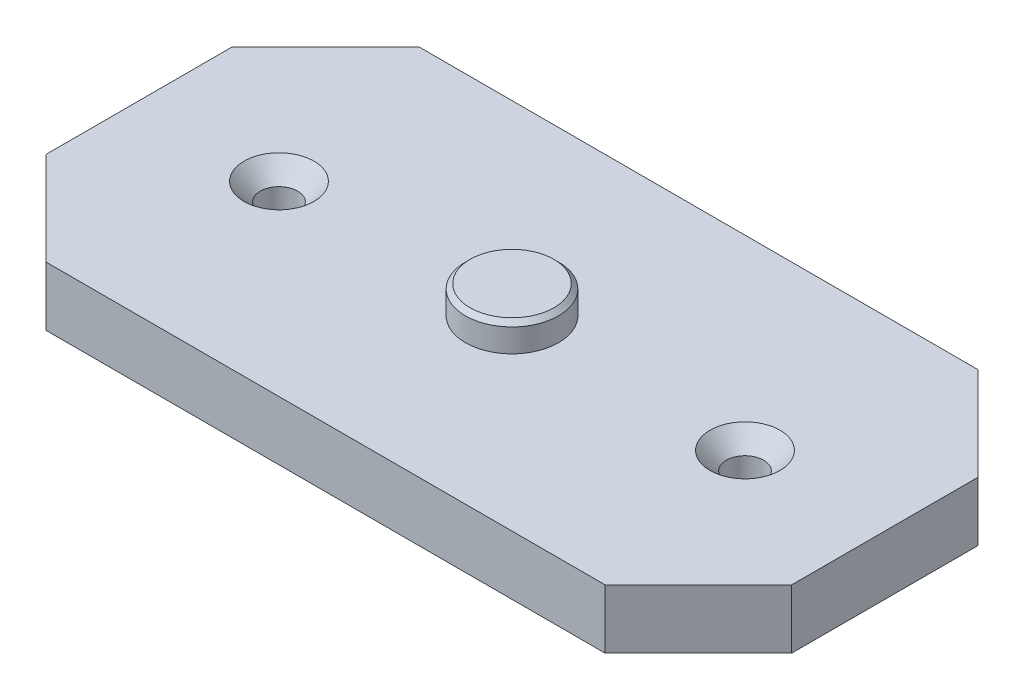
ISO-10303-21;
HEADER;
FILE_DESCRIPTION(('STEP AP214'),'2;1');
FILE_NAME('part.step','',(''),(''),'','','');
FILE_SCHEMA(('AUTOMOTIVE_DESIGN { 1 0 10303 214 1 1 1 1 }'));
ENDSEC;
DATA;
#1=APPLICATION_CONTEXT('core data for automotive mechanical design processes');
#2=APPLICATION_PROTOCOL_DEFINITION('international standard','automotive_design',2000,#1);
#3=PRODUCT_CONTEXT('',#1,'mechanical');
#4=PRODUCT('Part','Part','',(#3));
#5=PRODUCT_RELATED_PRODUCT_CATEGORY('part','',(#4));
#6=PRODUCT_DEFINITION_FORMATION('','',#4);
#7=PRODUCT_DEFINITION_CONTEXT('part definition',#1,'design');
#8=PRODUCT_DEFINITION('design','',#6,#7);
#9=PRODUCT_DEFINITION_SHAPE('','',#8);
#10=(LENGTH_UNIT() NAMED_UNIT(*) SI_UNIT(.MILLI.,.METRE.));
#11=(NAMED_UNIT(*) PLANE_ANGLE_UNIT() SI_UNIT($,.RADIAN.));
#12=(NAMED_UNIT(*) SI_UNIT($,.STERADIAN.) SOLID_ANGLE_UNIT());
#13=UNCERTAINTY_MEASURE_WITH_UNIT(LENGTH_MEASURE(1.E-05),#10,'distance_accuracy_value','');
#14=(GEOMETRIC_REPRESENTATION_CONTEXT(3) GLOBAL_UNCERTAINTY_ASSIGNED_CONTEXT((#13)) GLOBAL_UNIT_ASSIGNED_CONTEXT((#10,
#11,#12)) REPRESENTATION_CONTEXT('',''));
#15=CARTESIAN_POINT('',(0.,0.,0.));
#16=DIRECTION('',(0.,0.,1.));
#17=DIRECTION('',(1.,0.,0.));
#18=AXIS2_PLACEMENT_3D('',#15,#16,#17);
#19=CARTESIAN_POINT('',(0.,6.35,0.));
#20=DIRECTION('',(0.,-1.,0.));
#21=DIRECTION('',(0.,0.,-1.));
#22=AXIS2_PLACEMENT_3D('',#19,#20,#21);
#23=PLANE('',#22);
#24=CARTESIAN_POINT('',(0.,6.35,0.));
#25=DIRECTION('',(0.,-1.,0.));
#26=DIRECTION('',(0.,0.,-1.));
#27=AXIS2_PLACEMENT_3D('',#24,#25,#26);
#28=CIRCLE('',#27,5.);
#29=CARTESIAN_POINT('',(0.,6.35,-5.));
#30=VERTEX_POINT('',#29);
#31=EDGE_CURVE('E283',#30,#30,#28,.T.);
#32=ORIENTED_EDGE('',*,*,#31,.T.);
#33=EDGE_LOOP('',(#32));
#34=FACE_BOUND('',#33,.T.);
#35=DIRECTION('',(0.,0.,1.));
#36=VECTOR('',#35,1.);
#37=CARTESIAN_POINT('',(-40.,6.35,20.));
#38=LINE('',#37,#36);
#39=CARTESIAN_POINT('',(-40.,6.35,-10.));
#40=VERTEX_POINT('',#39);
#41=CARTESIAN_POINT('',(-40.,6.35,9.99999999999996));
#42=VERTEX_POINT('',#41);
#43=EDGE_CURVE('E263',#40,#42,#38,.T.);
#44=ORIENTED_EDGE('',*,*,#43,.T.);
#45=DIRECTION('',(-0.707106781186547,0.,-0.707106781186549));
#46=VECTOR('',#45,1.);
#47=CARTESIAN_POINT('',(-30.,6.35,20.));
#48=LINE('',#47,#46);
#49=CARTESIAN_POINT('',(-30.,6.35,20.));
#50=VERTEX_POINT('',#49);
#51=EDGE_CURVE('E160',#42,#50,#48,.F.);
#52=ORIENTED_EDGE('',*,*,#51,.T.);
#53=DIRECTION('',(1.,0.,0.));
#54=VECTOR('',#53,1.);
#55=CARTESIAN_POINT('',(-40.,6.35,20.));
#56=LINE('',#55,#54);
#57=CARTESIAN_POINT('',(30.,6.35,20.));
#58=VERTEX_POINT('',#57);
#59=EDGE_CURVE('E129',#50,#58,#56,.T.);
#60=ORIENTED_EDGE('',*,*,#59,.T.);
#61=DIRECTION('',(-0.707106781186549,0.,0.707106781186547));
#62=VECTOR('',#61,1.);
#63=CARTESIAN_POINT('',(40.,6.35,10.));
#64=LINE('',#63,#62);
#65=CARTESIAN_POINT('',(40.,6.35,10.));
#66=VERTEX_POINT('',#65);
#67=EDGE_CURVE('E155',#58,#66,#64,.F.);
#68=ORIENTED_EDGE('',*,*,#67,.T.);
#69=DIRECTION('',(0.,0.,-1.));
#70=VECTOR('',#69,1.);
#71=CARTESIAN_POINT('',(40.,6.35,20.));
#72=LINE('',#71,#70);
#73=CARTESIAN_POINT('',(40.,6.35,-9.99999999999998));
#74=VERTEX_POINT('',#73);
#75=EDGE_CURVE('E135',#66,#74,#72,.T.);
#76=ORIENTED_EDGE('',*,*,#75,.T.);
#77=DIRECTION('',(0.707106781186547,0.,0.707106781186549));
#78=VECTOR('',#77,1.);
#79=CARTESIAN_POINT('',(30.,6.35,-20.));
#80=LINE('',#79,#78);
#81=CARTESIAN_POINT('',(30.,6.35,-20.));
#82=VERTEX_POINT('',#81);
#83=EDGE_CURVE('E64',#74,#82,#80,.F.);
#84=ORIENTED_EDGE('',*,*,#83,.T.);
#85=DIRECTION('',(-1.,0.,0.));
#86=VECTOR('',#85,1.);
#87=CARTESIAN_POINT('',(-40.,6.35,-20.));
#88=LINE('',#87,#86);
#89=CARTESIAN_POINT('',(-30.,6.35,-20.));
#90=VERTEX_POINT('',#89);
#91=EDGE_CURVE('E138',#82,#90,#88,.T.);
#92=ORIENTED_EDGE('',*,*,#91,.T.);
#93=DIRECTION('',(0.707106781186549,0.,-0.707106781186547));
#94=VECTOR('',#93,1.);
#95=CARTESIAN_POINT('',(-40.,6.35,-10.));
#96=LINE('',#95,#94);
#97=EDGE_CURVE('E158',#90,#40,#96,.F.);
#98=ORIENTED_EDGE('',*,*,#97,.T.);
#99=EDGE_LOOP('',(#44,#52,#60,#68,#76,#84,#92,#98));
#100=FACE_BOUND('',#99,.T.);
#101=CARTESIAN_POINT('',(25.,6.35,0.));
#102=DIRECTION('',(0.,1.,0.));
#103=DIRECTION('',(0.,0.,1.));
#104=AXIS2_PLACEMENT_3D('',#101,#102,#103);
#105=CIRCLE('',#104,3.75);
#106=CARTESIAN_POINT('',(25.,6.35,3.75000000000001));
#107=VERTEX_POINT('',#106);
#108=EDGE_CURVE('E271',#107,#107,#105,.T.);
#109=ORIENTED_EDGE('',*,*,#108,.F.);
#110=EDGE_LOOP('',(#109));
#111=FACE_BOUND('',#110,.T.);
#112=CARTESIAN_POINT('',(-25.,6.35,0.));
#113=DIRECTION('',(0.,1.,0.));
#114=DIRECTION('',(0.,0.,1.));
#115=AXIS2_PLACEMENT_3D('',#112,#113,#114);
#116=CIRCLE('',#115,3.75);
#117=CARTESIAN_POINT('',(-25.,6.35,3.75000000000001));
#118=VERTEX_POINT('',#117);
#119=EDGE_CURVE('E280',#118,#118,#116,.T.);
#120=ORIENTED_EDGE('',*,*,#119,.F.);
#121=EDGE_LOOP('',(#120));
#122=FACE_BOUND('',#121,.T.);
#123=ADVANCED_FACE('F41',(#34,#100,#111,#122),#23,.F.);
#124=CARTESIAN_POINT('',(40.,6.35,20.));
#125=DIRECTION('',(-1.,0.,0.));
#126=DIRECTION('',(0.,0.,1.));
#127=AXIS2_PLACEMENT_3D('',#124,#125,#126);
#128=PLANE('',#127);
#129=DIRECTION('',(0.,0.,-1.));
#130=VECTOR('',#129,1.);
#131=CARTESIAN_POINT('',(40.,0.,20.));
#132=LINE('',#131,#130);
#133=CARTESIAN_POINT('',(40.,0.,10.));
#134=VERTEX_POINT('',#133);
#135=CARTESIAN_POINT('',(40.,0.,-9.99999999999998));
#136=VERTEX_POINT('',#135);
#137=EDGE_CURVE('E256',#134,#136,#132,.T.);
#138=ORIENTED_EDGE('',*,*,#137,.T.);
#139=DIRECTION('',(0.,1.,0.));
#140=VECTOR('',#139,1.);
#141=CARTESIAN_POINT('',(40.,6.35,-9.99999999999998));
#142=LINE('',#141,#140);
#143=EDGE_CURVE('E169',#136,#74,#142,.T.);
#144=ORIENTED_EDGE('',*,*,#143,.T.);
#145=ORIENTED_EDGE('',*,*,#75,.F.);
#146=DIRECTION('',(0.,-1.,0.));
#147=VECTOR('',#146,1.);
#148=CARTESIAN_POINT('',(40.,6.35,10.));
#149=LINE('',#148,#147);
#150=EDGE_CURVE('E166',#66,#134,#149,.T.);
#151=ORIENTED_EDGE('',*,*,#150,.T.);
#152=EDGE_LOOP('',(#138,#144,#145,#151));
#153=FACE_BOUND('',#152,.T.);
#154=ADVANCED_FACE('F191',(#153),#128,.F.);
#155=CARTESIAN_POINT('',(-40.,6.35,-20.));
#156=DIRECTION('',(0.,0.,1.));
#157=DIRECTION('',(1.,0.,0.));
#158=AXIS2_PLACEMENT_3D('',#155,#156,#157);
#159=PLANE('',#158);
#160=DIRECTION('',(-1.,0.,0.));
#161=VECTOR('',#160,1.);
#162=CARTESIAN_POINT('',(-40.,0.,-20.));
#163=LINE('',#162,#161);
#164=CARTESIAN_POINT('',(30.,0.,-20.));
#165=VERTEX_POINT('',#164);
#166=CARTESIAN_POINT('',(-30.,0.,-20.));
#167=VERTEX_POINT('',#166);
#168=EDGE_CURVE('E140',#165,#167,#163,.T.);
#169=ORIENTED_EDGE('',*,*,#168,.T.);
#170=DIRECTION('',(0.,1.,0.));
#171=VECTOR('',#170,1.);
#172=CARTESIAN_POINT('',(-30.,6.35,-20.));
#173=LINE('',#172,#171);
#174=EDGE_CURVE('E57',#167,#90,#173,.T.);
#175=ORIENTED_EDGE('',*,*,#174,.T.);
#176=ORIENTED_EDGE('',*,*,#91,.F.);
#177=DIRECTION('',(0.,-1.,0.));
#178=VECTOR('',#177,1.);
#179=CARTESIAN_POINT('',(30.,6.35,-20.));
#180=LINE('',#179,#178);
#181=EDGE_CURVE('E162',#82,#165,#180,.T.);
#182=ORIENTED_EDGE('',*,*,#181,.T.);
#183=EDGE_LOOP('',(#169,#175,#176,#182));
#184=FACE_BOUND('',#183,.T.);
#185=ADVANCED_FACE('F198',(#184),#159,.F.);
#186=CARTESIAN_POINT('',(-40.,6.35,20.));
#187=DIRECTION('',(1.,0.,0.));
#188=DIRECTION('',(0.,0.,-1.));
#189=AXIS2_PLACEMENT_3D('',#186,#187,#188);
#190=PLANE('',#189);
#191=DIRECTION('',(0.,0.,1.));
#192=VECTOR('',#191,1.);
#193=CARTESIAN_POINT('',(-40.,0.,20.));
#194=LINE('',#193,#192);
#195=CARTESIAN_POINT('',(-40.,0.,-10.));
#196=VERTEX_POINT('',#195);
#197=CARTESIAN_POINT('',(-40.,0.,9.99999999999996));
#198=VERTEX_POINT('',#197);
#199=EDGE_CURVE('E136',#196,#198,#194,.T.);
#200=ORIENTED_EDGE('',*,*,#199,.T.);
#201=DIRECTION('',(0.,1.,0.));
#202=VECTOR('',#201,1.);
#203=CARTESIAN_POINT('',(-40.,6.35,9.99999999999996));
#204=LINE('',#203,#202);
#205=EDGE_CURVE('E114',#198,#42,#204,.T.);
#206=ORIENTED_EDGE('',*,*,#205,.T.);
#207=ORIENTED_EDGE('',*,*,#43,.F.);
#208=DIRECTION('',(0.,-1.,0.));
#209=VECTOR('',#208,1.);
#210=CARTESIAN_POINT('',(-40.,6.35,-10.));
#211=LINE('',#210,#209);
#212=EDGE_CURVE('E119',#40,#196,#211,.T.);
#213=ORIENTED_EDGE('',*,*,#212,.T.);
#214=EDGE_LOOP('',(#200,#206,#207,#213));
#215=FACE_BOUND('',#214,.T.);
#216=ADVANCED_FACE('F211',(#215),#190,.F.);
#217=CARTESIAN_POINT('',(-40.,6.35,20.));
#218=DIRECTION('',(0.,0.,-1.));
#219=DIRECTION('',(-1.,0.,0.));
#220=AXIS2_PLACEMENT_3D('',#217,#218,#219);
#221=PLANE('',#220);
#222=ORIENTED_EDGE('',*,*,#59,.F.);
#223=DIRECTION('',(0.,-1.,0.));
#224=VECTOR('',#223,1.);
#225=CARTESIAN_POINT('',(-30.,6.35,20.));
#226=LINE('',#225,#224);
#227=CARTESIAN_POINT('',(-30.,0.,20.));
#228=VERTEX_POINT('',#227);
#229=EDGE_CURVE('E113',#50,#228,#226,.T.);
#230=ORIENTED_EDGE('',*,*,#229,.T.);
#231=DIRECTION('',(1.,0.,0.));
#232=VECTOR('',#231,1.);
#233=CARTESIAN_POINT('',(-40.,0.,20.));
#234=LINE('',#233,#232);
#235=CARTESIAN_POINT('',(30.,0.,20.));
#236=VERTEX_POINT('',#235);
#237=EDGE_CURVE('E126',#228,#236,#234,.T.);
#238=ORIENTED_EDGE('',*,*,#237,.T.);
#239=DIRECTION('',(0.,1.,0.));
#240=VECTOR('',#239,1.);
#241=CARTESIAN_POINT('',(30.,6.35,20.));
#242=LINE('',#241,#240);
#243=EDGE_CURVE('E131',#236,#58,#242,.T.);
#244=ORIENTED_EDGE('',*,*,#243,.T.);
#245=EDGE_LOOP('',(#222,#230,#238,#244));
#246=FACE_BOUND('',#245,.T.);
#247=ADVANCED_FACE('F125',(#246),#221,.F.);
#248=CARTESIAN_POINT('',(0.,0.,0.));
#249=DIRECTION('',(0.,-1.,0.));
#250=DIRECTION('',(0.,0.,-1.));
#251=AXIS2_PLACEMENT_3D('',#248,#249,#250);
#252=PLANE('',#251);
#253=CARTESIAN_POINT('',(0.,0.,0.));
#254=DIRECTION('',(0.,-1.,0.));
#255=DIRECTION('',(0.,0.,-1.));
#256=AXIS2_PLACEMENT_3D('',#253,#254,#255);
#257=CIRCLE('',#256,5.);
#258=CARTESIAN_POINT('',(0.,0.,-5.));
#259=VERTEX_POINT('',#258);
#260=EDGE_CURVE('E144',#259,#259,#257,.T.);
#261=ORIENTED_EDGE('',*,*,#260,.F.);
#262=EDGE_LOOP('',(#261));
#263=FACE_BOUND('',#262,.T.);
#264=CARTESIAN_POINT('',(-25.,0.,0.));
#265=DIRECTION('',(0.,-1.,0.));
#266=DIRECTION('',(0.,0.,-1.));
#267=AXIS2_PLACEMENT_3D('',#264,#265,#266);
#268=CIRCLE('',#267,2.);
#269=CARTESIAN_POINT('',(-25.,0.,-1.99999999999999));
#270=VERTEX_POINT('',#269);
#271=EDGE_CURVE('E274',#270,#270,#268,.T.);
#272=ORIENTED_EDGE('',*,*,#271,.F.);
#273=EDGE_LOOP('',(#272));
#274=FACE_BOUND('',#273,.T.);
#275=CARTESIAN_POINT('',(25.,0.,0.));
#276=DIRECTION('',(0.,-1.,0.));
#277=DIRECTION('',(0.,0.,-1.));
#278=AXIS2_PLACEMENT_3D('',#275,#276,#277);
#279=CIRCLE('',#278,2.);
#280=CARTESIAN_POINT('',(25.,0.,-1.99999999999999));
#281=VERTEX_POINT('',#280);
#282=EDGE_CURVE('E259',#281,#281,#279,.T.);
#283=ORIENTED_EDGE('',*,*,#282,.F.);
#284=EDGE_LOOP('',(#283));
#285=FACE_BOUND('',#284,.T.);
#286=ORIENTED_EDGE('',*,*,#237,.F.);
#287=DIRECTION('',(0.707106781186547,0.,0.707106781186549));
#288=VECTOR('',#287,1.);
#289=CARTESIAN_POINT('',(-25.,0.,25.));
#290=LINE('',#289,#288);
#291=EDGE_CURVE('E109',#228,#198,#290,.F.);
#292=ORIENTED_EDGE('',*,*,#291,.T.);
#293=ORIENTED_EDGE('',*,*,#199,.F.);
#294=DIRECTION('',(-0.707106781186549,0.,0.707106781186547));
#295=VECTOR('',#294,1.);
#296=CARTESIAN_POINT('',(-25.,0.,-25.));
#297=LINE('',#296,#295);
#298=EDGE_CURVE('E120',#196,#167,#297,.F.);
#299=ORIENTED_EDGE('',*,*,#298,.T.);
#300=ORIENTED_EDGE('',*,*,#168,.F.);
#301=DIRECTION('',(-0.707106781186547,0.,-0.707106781186549));
#302=VECTOR('',#301,1.);
#303=CARTESIAN_POINT('',(25.,0.,-25.));
#304=LINE('',#303,#302);
#305=EDGE_CURVE('E149',#165,#136,#304,.F.);
#306=ORIENTED_EDGE('',*,*,#305,.T.);
#307=ORIENTED_EDGE('',*,*,#137,.F.);
#308=DIRECTION('',(0.707106781186549,0.,-0.707106781186547));
#309=VECTOR('',#308,1.);
#310=CARTESIAN_POINT('',(24.9999999999999,0.,25.));
#311=LINE('',#310,#309);
#312=EDGE_CURVE('E130',#134,#236,#311,.F.);
#313=ORIENTED_EDGE('',*,*,#312,.T.);
#314=EDGE_LOOP('',(#286,#292,#293,#299,#300,#306,#307,#313));
#315=FACE_BOUND('',#314,.T.);
#316=ADVANCED_FACE('F133',(#263,#274,#285,#315),#252,.T.);
#317=CARTESIAN_POINT('',(25.,6.35,0.));
#318=DIRECTION('',(0.,1.,0.));
#319=DIRECTION('',(0.,0.,1.));
#320=AXIS2_PLACEMENT_3D('',#317,#318,#319);
#321=CYLINDRICAL_SURFACE('',#320,2.);
#322=CARTESIAN_POINT('',(25.,4.44021012312877,0.));
#323=DIRECTION('',(0.,1.,0.));
#324=DIRECTION('',(0.,0.,1.));
#325=AXIS2_PLACEMENT_3D('',#322,#323,#324);
#326=CIRCLE('',#325,2.);
#327=CARTESIAN_POINT('',(25.,4.44021012312877,2.));
#328=VERTEX_POINT('',#327);
#329=EDGE_CURVE('E268',#328,#328,#326,.T.);
#330=ORIENTED_EDGE('',*,*,#329,.T.);
#331=EDGE_LOOP('',(#330));
#332=FACE_BOUND('',#331,.T.);
#333=ORIENTED_EDGE('',*,*,#282,.T.);
#334=EDGE_LOOP('',(#333));
#335=FACE_BOUND('',#334,.T.);
#336=ADVANCED_FACE('F204',(#332,#335),#321,.F.);
#337=CARTESIAN_POINT('',(25.,6.35,0.));
#338=DIRECTION('',(0.,1.,0.));
#339=DIRECTION('',(0.,0.,1.));
#340=AXIS2_PLACEMENT_3D('',#337,#338,#339);
#341=CONICAL_SURFACE('',#340,3.75,0.74176493209759);
#342=ORIENTED_EDGE('',*,*,#329,.F.);
#343=EDGE_LOOP('',(#342));
#344=FACE_BOUND('',#343,.T.);
#345=ORIENTED_EDGE('',*,*,#108,.T.);
#346=EDGE_LOOP('',(#345));
#347=FACE_BOUND('',#346,.T.);
#348=ADVANCED_FACE('F305',(#344,#347),#341,.F.);
#349=CARTESIAN_POINT('',(-25.,6.35,0.));
#350=DIRECTION('',(0.,1.,0.));
#351=DIRECTION('',(0.,0.,1.));
#352=AXIS2_PLACEMENT_3D('',#349,#350,#351);
#353=CYLINDRICAL_SURFACE('',#352,2.);
#354=CARTESIAN_POINT('',(-25.,4.44021012312877,0.));
#355=DIRECTION('',(0.,1.,0.));
#356=DIRECTION('',(0.,0.,1.));
#357=AXIS2_PLACEMENT_3D('',#354,#355,#356);
#358=CIRCLE('',#357,2.);
#359=CARTESIAN_POINT('',(-25.,4.44021012312877,2.));
#360=VERTEX_POINT('',#359);
#361=EDGE_CURVE('E277',#360,#360,#358,.T.);
#362=ORIENTED_EDGE('',*,*,#361,.T.);
#363=EDGE_LOOP('',(#362));
#364=FACE_BOUND('',#363,.T.);
#365=ORIENTED_EDGE('',*,*,#271,.T.);
#366=EDGE_LOOP('',(#365));
#367=FACE_BOUND('',#366,.T.);
#368=ADVANCED_FACE('F302',(#364,#367),#353,.F.);
#369=CARTESIAN_POINT('',(-25.,6.35,0.));
#370=DIRECTION('',(0.,1.,0.));
#371=DIRECTION('',(0.,0.,1.));
#372=AXIS2_PLACEMENT_3D('',#369,#370,#371);
#373=CONICAL_SURFACE('',#372,3.75,0.74176493209759);
#374=ORIENTED_EDGE('',*,*,#361,.F.);
#375=EDGE_LOOP('',(#374));
#376=FACE_BOUND('',#375,.T.);
#377=ORIENTED_EDGE('',*,*,#119,.T.);
#378=EDGE_LOOP('',(#377));
#379=FACE_BOUND('',#378,.T.);
#380=ADVANCED_FACE('F300',(#376,#379),#373,.F.);
#381=CARTESIAN_POINT('',(0.,-8.65,0.));
#382=DIRECTION('',(0.,1.,0.));
#383=DIRECTION('',(0.,0.,1.));
#384=AXIS2_PLACEMENT_3D('',#381,#382,#383);
#385=PLANE('',#384);
#386=CARTESIAN_POINT('',(0.,-8.65,0.));
#387=DIRECTION('',(0.,1.,0.));
#388=DIRECTION('',(0.,0.,1.));
#389=AXIS2_PLACEMENT_3D('',#386,#387,#388);
#390=CIRCLE('',#389,4.5);
#391=CARTESIAN_POINT('',(0.,-8.65,4.5));
#392=VERTEX_POINT('',#391);
#393=EDGE_CURVE('E174',#392,#392,#390,.F.);
#394=ORIENTED_EDGE('',*,*,#393,.T.);
#395=EDGE_LOOP('',(#394));
#396=FACE_BOUND('',#395,.T.);
#397=ADVANCED_FACE('F296',(#396),#385,.F.);
#398=CARTESIAN_POINT('',(0.,-8.65,0.));
#399=DIRECTION('',(0.,1.,0.));
#400=DIRECTION('',(0.,0.,1.));
#401=AXIS2_PLACEMENT_3D('',#398,#399,#400);
#402=CYLINDRICAL_SURFACE('',#401,5.);
#403=CARTESIAN_POINT('',(0.,-8.15000000000001,0.));
#404=DIRECTION('',(0.,1.,0.));
#405=DIRECTION('',(0.,0.,1.));
#406=AXIS2_PLACEMENT_3D('',#403,#404,#405);
#407=CIRCLE('',#406,5.);
#408=CARTESIAN_POINT('',(0.,-8.15000000000001,5.));
#409=VERTEX_POINT('',#408);
#410=EDGE_CURVE('E171',#409,#409,#407,.T.);
#411=ORIENTED_EDGE('',*,*,#410,.T.);
#412=EDGE_LOOP('',(#411));
#413=FACE_BOUND('',#412,.T.);
#414=ORIENTED_EDGE('',*,*,#260,.T.);
#415=EDGE_LOOP('',(#414));
#416=FACE_BOUND('',#415,.T.);
#417=ADVANCED_FACE('F288',(#413,#416),#402,.T.);
#418=CARTESIAN_POINT('',(0.,8.85,0.));
#419=DIRECTION('',(0.,1.,0.));
#420=DIRECTION('',(0.,0.,1.));
#421=AXIS2_PLACEMENT_3D('',#418,#419,#420);
#422=CIRCLE('',#421,5.);
#423=CARTESIAN_POINT('',(0.,8.85,5.));
#424=VERTEX_POINT('',#423);
#425=EDGE_CURVE('E11',#424,#424,#422,.F.);
#426=ORIENTED_EDGE('',*,*,#425,.T.);
#427=EDGE_LOOP('',(#426));
#428=FACE_BOUND('',#427,.T.);
#429=ORIENTED_EDGE('',*,*,#31,.F.);
#430=EDGE_LOOP('',(#429));
#431=FACE_BOUND('',#430,.T.);
#432=ADVANCED_FACE('F286',(#428,#431),#402,.T.);
#433=CARTESIAN_POINT('',(0.,9.35,0.));
#434=DIRECTION('',(0.,1.,0.));
#435=DIRECTION('',(0.,0.,1.));
#436=AXIS2_PLACEMENT_3D('',#433,#434,#435);
#437=PLANE('',#436);
#438=CARTESIAN_POINT('',(0.,9.35,0.));
#439=DIRECTION('',(0.,1.,0.));
#440=DIRECTION('',(0.,0.,1.));
#441=AXIS2_PLACEMENT_3D('',#438,#439,#440);
#442=CIRCLE('',#441,4.49999999999999);
#443=CARTESIAN_POINT('',(0.,9.35,4.49999999999999));
#444=VERTEX_POINT('',#443);
#445=EDGE_CURVE('E50',#444,#444,#442,.T.);
#446=ORIENTED_EDGE('',*,*,#445,.T.);
#447=EDGE_LOOP('',(#446));
#448=FACE_BOUND('',#447,.T.);
#449=ADVANCED_FACE('F179',(#448),#437,.T.);
#450=CARTESIAN_POINT('',(-30.,6.35,20.));
#451=DIRECTION('',(0.707106781186549,0.,-0.707106781186547));
#452=DIRECTION('',(0.,-1.,0.));
#453=AXIS2_PLACEMENT_3D('',#450,#451,#452);
#454=PLANE('',#453);
#455=ORIENTED_EDGE('',*,*,#51,.F.);
#456=ORIENTED_EDGE('',*,*,#205,.F.);
#457=ORIENTED_EDGE('',*,*,#291,.F.);
#458=ORIENTED_EDGE('',*,*,#229,.F.);
#459=EDGE_LOOP('',(#455,#456,#457,#458));
#460=FACE_BOUND('',#459,.T.);
#461=ADVANCED_FACE('F112',(#460),#454,.F.);
#462=CARTESIAN_POINT('',(-40.,6.35,-10.));
#463=DIRECTION('',(0.707106781186546,0.,0.707106781186548));
#464=DIRECTION('',(0.,-1.,0.));
#465=AXIS2_PLACEMENT_3D('',#462,#463,#464);
#466=PLANE('',#465);
#467=ORIENTED_EDGE('',*,*,#97,.F.);
#468=ORIENTED_EDGE('',*,*,#174,.F.);
#469=ORIENTED_EDGE('',*,*,#298,.F.);
#470=ORIENTED_EDGE('',*,*,#212,.F.);
#471=EDGE_LOOP('',(#467,#468,#469,#470));
#472=FACE_BOUND('',#471,.T.);
#473=ADVANCED_FACE('F223',(#472),#466,.F.);
#474=CARTESIAN_POINT('',(30.,6.35,-20.));
#475=DIRECTION('',(-0.707106781186548,0.,0.707106781186546));
#476=DIRECTION('',(0.,-1.,0.));
#477=AXIS2_PLACEMENT_3D('',#474,#475,#476);
#478=PLANE('',#477);
#479=ORIENTED_EDGE('',*,*,#83,.F.);
#480=ORIENTED_EDGE('',*,*,#143,.F.);
#481=ORIENTED_EDGE('',*,*,#305,.F.);
#482=ORIENTED_EDGE('',*,*,#181,.F.);
#483=EDGE_LOOP('',(#479,#480,#481,#482));
#484=FACE_BOUND('',#483,.T.);
#485=ADVANCED_FACE('F229',(#484),#478,.F.);
#486=CARTESIAN_POINT('',(40.,6.35,10.));
#487=DIRECTION('',(-0.707106781186546,0.,-0.707106781186548));
#488=DIRECTION('',(0.,-1.,0.));
#489=AXIS2_PLACEMENT_3D('',#486,#487,#488);
#490=PLANE('',#489);
#491=ORIENTED_EDGE('',*,*,#67,.F.);
#492=ORIENTED_EDGE('',*,*,#243,.F.);
#493=ORIENTED_EDGE('',*,*,#312,.F.);
#494=ORIENTED_EDGE('',*,*,#150,.F.);
#495=EDGE_LOOP('',(#491,#492,#493,#494));
#496=FACE_BOUND('',#495,.T.);
#497=ADVANCED_FACE('F187',(#496),#490,.F.);
#498=CARTESIAN_POINT('',(0.,-8.15000000000001,0.));
#499=DIRECTION('',(0.,1.,0.));
#500=DIRECTION('',(0.,0.,1.));
#501=AXIS2_PLACEMENT_3D('',#498,#499,#500);
#502=CONICAL_SURFACE('',#501,5.,0.785398163397451);
#503=ORIENTED_EDGE('',*,*,#393,.F.);
#504=EDGE_LOOP('',(#503));
#505=FACE_BOUND('',#504,.T.);
#506=ORIENTED_EDGE('',*,*,#410,.F.);
#507=EDGE_LOOP('',(#506));
#508=FACE_BOUND('',#507,.T.);
#509=ADVANCED_FACE('F182',(#505,#508),#502,.T.);
#510=CARTESIAN_POINT('',(0.,9.35,0.));
#511=DIRECTION('',(0.,-1.,0.));
#512=DIRECTION('',(0.,0.,-1.));
#513=AXIS2_PLACEMENT_3D('',#510,#511,#512);
#514=CONICAL_SURFACE('',#513,4.49999999999999,0.785398163397458);
#515=ORIENTED_EDGE('',*,*,#425,.F.);
#516=EDGE_LOOP('',(#515));
#517=FACE_BOUND('',#516,.T.);
#518=ORIENTED_EDGE('',*,*,#445,.F.);
#519=EDGE_LOOP('',(#518));
#520=FACE_BOUND('',#519,.T.);
#521=ADVANCED_FACE('F44',(#517,#520),#514,.T.);
#522=CLOSED_SHELL('',(#123,#154,#185,#216,#247,#316,#336,#348,#368,#380,#397,#417,#432,#449,
#461,#473,#485,#497,#509,#521));
#523=MANIFOLD_SOLID_BREP('B2',#522);
#524=ADVANCED_BREP_SHAPE_REPRESENTATION('',(#18,#523),#14);
#525=SHAPE_DEFINITION_REPRESENTATION(#9,#524);
ENDSEC;
END-ISO-10303-21;
